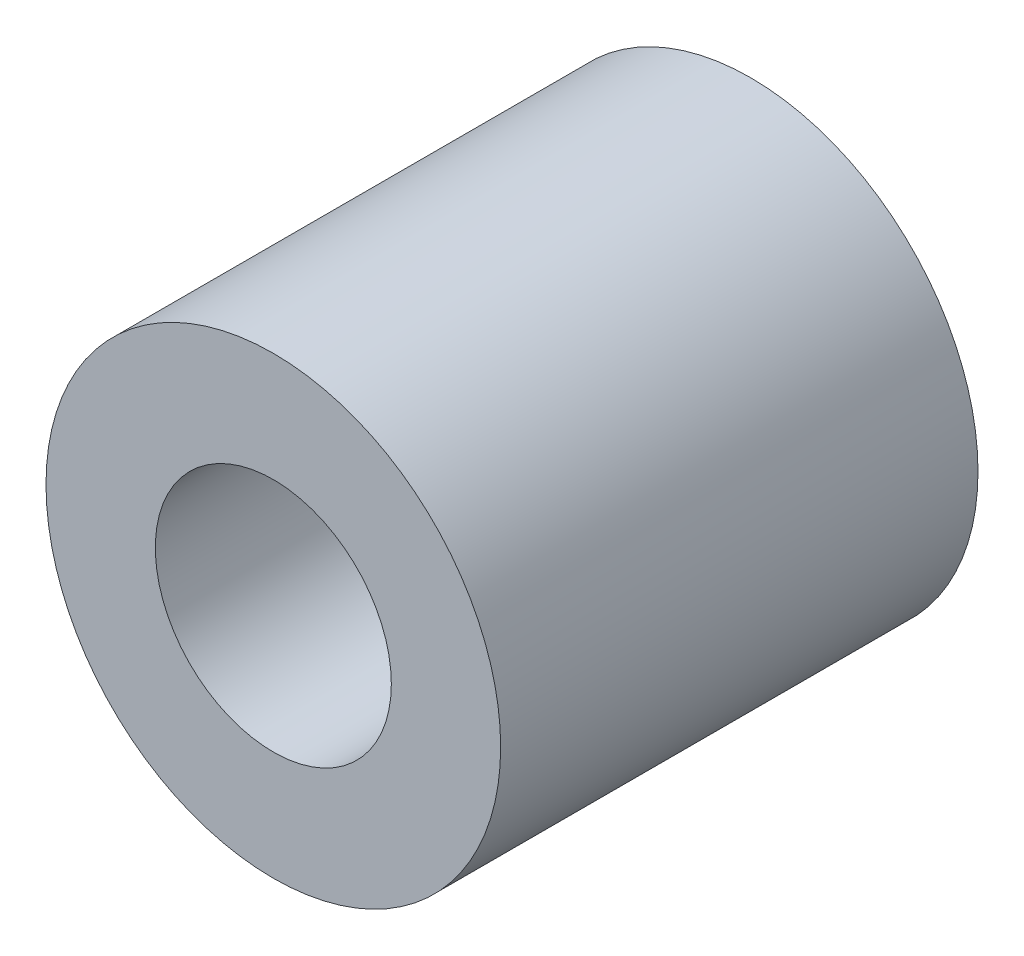
ISO-10303-21;
HEADER;
FILE_DESCRIPTION(('STEP AP214'),'2;1');
FILE_NAME('part.step','',(''),(''),'','','');
FILE_SCHEMA(('AUTOMOTIVE_DESIGN { 1 0 10303 214 1 1 1 1 }'));
ENDSEC;
DATA;
#1=APPLICATION_CONTEXT('core data for automotive mechanical design processes');
#2=APPLICATION_PROTOCOL_DEFINITION('international standard','automotive_design',2000,#1);
#3=PRODUCT_CONTEXT('',#1,'mechanical');
#4=PRODUCT('Part','Part','',(#3));
#5=PRODUCT_RELATED_PRODUCT_CATEGORY('part','',(#4));
#6=PRODUCT_DEFINITION_FORMATION('','',#4);
#7=PRODUCT_DEFINITION_CONTEXT('part definition',#1,'design');
#8=PRODUCT_DEFINITION('design','',#6,#7);
#9=PRODUCT_DEFINITION_SHAPE('','',#8);
#10=(LENGTH_UNIT() NAMED_UNIT(*) SI_UNIT(.MILLI.,.METRE.));
#11=(NAMED_UNIT(*) PLANE_ANGLE_UNIT() SI_UNIT($,.RADIAN.));
#12=(NAMED_UNIT(*) SI_UNIT($,.STERADIAN.) SOLID_ANGLE_UNIT());
#13=UNCERTAINTY_MEASURE_WITH_UNIT(LENGTH_MEASURE(1.E-05),#10,'distance_accuracy_value','');
#14=(GEOMETRIC_REPRESENTATION_CONTEXT(3) GLOBAL_UNCERTAINTY_ASSIGNED_CONTEXT((#13)) GLOBAL_UNIT_ASSIGNED_CONTEXT((#10,
#11,#12)) REPRESENTATION_CONTEXT('',''));
#15=CARTESIAN_POINT('',(0.,0.,0.));
#16=DIRECTION('',(0.,0.,1.));
#17=DIRECTION('',(1.,0.,0.));
#18=AXIS2_PLACEMENT_3D('',#15,#16,#17);
#19=CARTESIAN_POINT('',(0.,0.,100.));
#20=DIRECTION('',(0.,0.,1.));
#21=DIRECTION('',(1.,0.,0.));
#22=AXIS2_PLACEMENT_3D('',#19,#20,#21);
#23=PLANE('',#22);
#24=CARTESIAN_POINT('',(0.,0.,100.));
#25=DIRECTION('',(0.,0.,1.));
#26=DIRECTION('',(1.,0.,0.));
#27=AXIS2_PLACEMENT_3D('',#24,#25,#26);
#28=CIRCLE('',#27,47.6239545115605);
#29=CARTESIAN_POINT('',(47.6239545115605,0.,100.));
#30=VERTEX_POINT('',#29);
#31=EDGE_CURVE('E10',#30,#30,#28,.T.);
#32=ORIENTED_EDGE('',*,*,#31,.T.);
#33=EDGE_LOOP('',(#32));
#34=FACE_BOUND('',#33,.T.);
#35=CARTESIAN_POINT('',(0.,0.,100.));
#36=DIRECTION('',(0.,0.,1.));
#37=DIRECTION('',(1.,0.,0.));
#38=AXIS2_PLACEMENT_3D('',#35,#36,#37);
#39=CIRCLE('',#38,24.7234527680927);
#40=CARTESIAN_POINT('',(24.7234527680927,0.,100.));
#41=VERTEX_POINT('',#40);
#42=EDGE_CURVE('E48',#41,#41,#39,.T.);
#43=ORIENTED_EDGE('',*,*,#42,.F.);
#44=EDGE_LOOP('',(#43));
#45=FACE_BOUND('',#44,.T.);
#46=ADVANCED_FACE('F37',(#34,#45),#23,.T.);
#47=CARTESIAN_POINT('',(0.,0.,0.));
#48=DIRECTION('',(0.,0.,1.));
#49=DIRECTION('',(1.,0.,0.));
#50=AXIS2_PLACEMENT_3D('',#47,#48,#49);
#51=PLANE('',#50);
#52=CARTESIAN_POINT('',(0.,0.,0.));
#53=DIRECTION('',(0.,0.,1.));
#54=DIRECTION('',(1.,0.,0.));
#55=AXIS2_PLACEMENT_3D('',#52,#53,#54);
#56=CIRCLE('',#55,47.6239545115605);
#57=CARTESIAN_POINT('',(47.6239545115605,0.,0.));
#58=VERTEX_POINT('',#57);
#59=EDGE_CURVE('E41',#58,#58,#56,.T.);
#60=ORIENTED_EDGE('',*,*,#59,.F.);
#61=EDGE_LOOP('',(#60));
#62=FACE_BOUND('',#61,.T.);
#63=CARTESIAN_POINT('',(0.,0.,0.));
#64=DIRECTION('',(0.,0.,1.));
#65=DIRECTION('',(1.,0.,0.));
#66=AXIS2_PLACEMENT_3D('',#63,#64,#65);
#67=CIRCLE('',#66,24.7234527680927);
#68=CARTESIAN_POINT('',(24.7234527680927,0.,0.));
#69=VERTEX_POINT('',#68);
#70=EDGE_CURVE('E50',#69,#69,#67,.T.);
#71=ORIENTED_EDGE('',*,*,#70,.T.);
#72=EDGE_LOOP('',(#71));
#73=FACE_BOUND('',#72,.T.);
#74=ADVANCED_FACE('F60',(#62,#73),#51,.F.);
#75=CARTESIAN_POINT('',(0.,0.,100.));
#76=DIRECTION('',(0.,0.,-1.));
#77=DIRECTION('',(-1.,0.,0.));
#78=AXIS2_PLACEMENT_3D('',#75,#76,#77);
#79=CYLINDRICAL_SURFACE('',#78,47.6239545115605);
#80=ORIENTED_EDGE('',*,*,#31,.F.);
#81=EDGE_LOOP('',(#80));
#82=FACE_BOUND('',#81,.T.);
#83=ORIENTED_EDGE('',*,*,#59,.T.);
#84=EDGE_LOOP('',(#83));
#85=FACE_BOUND('',#84,.T.);
#86=ADVANCED_FACE('F39',(#82,#85),#79,.T.);
#87=CARTESIAN_POINT('',(0.,0.,100.));
#88=DIRECTION('',(0.,0.,-1.));
#89=DIRECTION('',(-1.,0.,0.));
#90=AXIS2_PLACEMENT_3D('',#87,#88,#89);
#91=CYLINDRICAL_SURFACE('',#90,24.7234527680927);
#92=ORIENTED_EDGE('',*,*,#42,.T.);
#93=EDGE_LOOP('',(#92));
#94=FACE_BOUND('',#93,.T.);
#95=ORIENTED_EDGE('',*,*,#70,.F.);
#96=EDGE_LOOP('',(#95));
#97=FACE_BOUND('',#96,.T.);
#98=ADVANCED_FACE('F56',(#94,#97),#91,.F.);
#99=CLOSED_SHELL('',(#46,#74,#86,#98));
#100=MANIFOLD_SOLID_BREP('B2',#99);
#101=ADVANCED_BREP_SHAPE_REPRESENTATION('',(#18,#100),#14);
#102=SHAPE_DEFINITION_REPRESENTATION(#9,#101);
ENDSEC;
END-ISO-10303-21;
